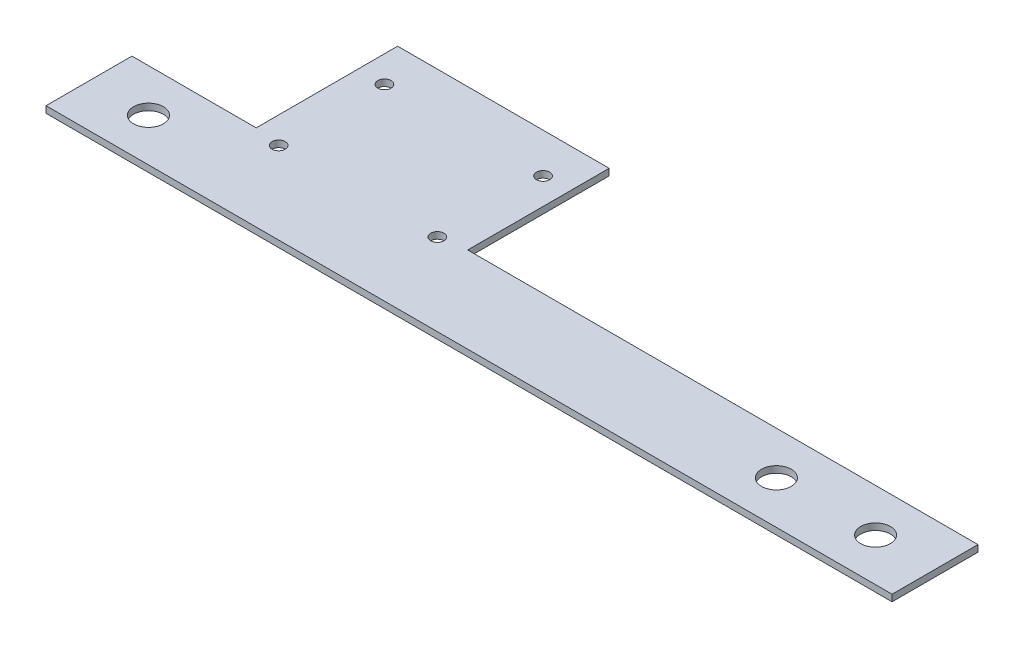
ISO-10303-21;
HEADER;
FILE_DESCRIPTION(('STEP AP214'),'2;1');
FILE_NAME('part.step','',(''),(''),'','','');
FILE_SCHEMA(('AUTOMOTIVE_DESIGN { 1 0 10303 214 1 1 1 1 }'));
ENDSEC;
DATA;
#1=APPLICATION_CONTEXT('core data for automotive mechanical design processes');
#2=APPLICATION_PROTOCOL_DEFINITION('international standard','automotive_design',2000,#1);
#3=PRODUCT_CONTEXT('',#1,'mechanical');
#4=PRODUCT('Part','Part','',(#3));
#5=PRODUCT_RELATED_PRODUCT_CATEGORY('part','',(#4));
#6=PRODUCT_DEFINITION_FORMATION('','',#4);
#7=PRODUCT_DEFINITION_CONTEXT('part definition',#1,'design');
#8=PRODUCT_DEFINITION('design','',#6,#7);
#9=PRODUCT_DEFINITION_SHAPE('','',#8);
#10=(LENGTH_UNIT() NAMED_UNIT(*) SI_UNIT(.MILLI.,.METRE.));
#11=(NAMED_UNIT(*) PLANE_ANGLE_UNIT() SI_UNIT($,.RADIAN.));
#12=(NAMED_UNIT(*) SI_UNIT($,.STERADIAN.) SOLID_ANGLE_UNIT());
#13=UNCERTAINTY_MEASURE_WITH_UNIT(LENGTH_MEASURE(1.E-05),#10,'distance_accuracy_value','');
#14=(GEOMETRIC_REPRESENTATION_CONTEXT(3) GLOBAL_UNCERTAINTY_ASSIGNED_CONTEXT((#13)) GLOBAL_UNIT_ASSIGNED_CONTEXT((#10,
#11,#12)) REPRESENTATION_CONTEXT('',''));
#15=CARTESIAN_POINT('',(0.,0.,0.));
#16=DIRECTION('',(0.,0.,1.));
#17=DIRECTION('',(1.,0.,0.));
#18=AXIS2_PLACEMENT_3D('',#15,#16,#17);
#19=CARTESIAN_POINT('',(0.,3.175,-41.2749999999999));
#20=DIRECTION('',(1.,0.,0.));
#21=DIRECTION('',(0.,0.,-1.));
#22=AXIS2_PLACEMENT_3D('',#19,#20,#21);
#23=PLANE('',#22);
#24=DIRECTION('',(0.,0.,1.));
#25=VECTOR('',#24,1.);
#26=CARTESIAN_POINT('',(0.,0.,-41.2749999999999));
#27=LINE('',#26,#25);
#28=CARTESIAN_POINT('',(0.,0.,-41.2749999999999));
#29=VERTEX_POINT('',#28);
#30=CARTESIAN_POINT('',(0.,0.,0.));
#31=VERTEX_POINT('',#30);
#32=EDGE_CURVE('E128',#29,#31,#27,.T.);
#33=ORIENTED_EDGE('',*,*,#32,.T.);
#34=DIRECTION('',(0.,-1.,0.));
#35=VECTOR('',#34,1.);
#36=CARTESIAN_POINT('',(0.,3.175,0.));
#37=LINE('',#36,#35);
#38=CARTESIAN_POINT('',(0.,3.175,0.));
#39=VERTEX_POINT('',#38);
#40=EDGE_CURVE('E11',#39,#31,#37,.T.);
#41=ORIENTED_EDGE('',*,*,#40,.F.);
#42=DIRECTION('',(0.,0.,1.));
#43=VECTOR('',#42,1.);
#44=CARTESIAN_POINT('',(0.,3.175,-41.2749999999999));
#45=LINE('',#44,#43);
#46=CARTESIAN_POINT('',(0.,3.175,-41.2749999999999));
#47=VERTEX_POINT('',#46);
#48=EDGE_CURVE('E143',#47,#39,#45,.T.);
#49=ORIENTED_EDGE('',*,*,#48,.F.);
#50=DIRECTION('',(0.,-1.,0.));
#51=VECTOR('',#50,1.);
#52=CARTESIAN_POINT('',(0.,3.175,-41.2749999999999));
#53=LINE('',#52,#51);
#54=EDGE_CURVE('E124',#47,#29,#53,.T.);
#55=ORIENTED_EDGE('',*,*,#54,.T.);
#56=EDGE_LOOP('',(#33,#41,#49,#55));
#57=FACE_BOUND('',#56,.T.);
#58=ADVANCED_FACE('F32',(#57),#23,.F.);
#59=CARTESIAN_POINT('',(0.,3.175,0.));
#60=DIRECTION('',(0.,0.,-1.));
#61=DIRECTION('',(-1.,0.,0.));
#62=AXIS2_PLACEMENT_3D('',#59,#60,#61);
#63=PLANE('',#62);
#64=DIRECTION('',(1.,0.,0.));
#65=VECTOR('',#64,1.);
#66=CARTESIAN_POINT('',(0.,0.,0.));
#67=LINE('',#66,#65);
#68=CARTESIAN_POINT('',(406.4,0.,0.));
#69=VERTEX_POINT('',#68);
#70=EDGE_CURVE('E131',#31,#69,#67,.T.);
#71=ORIENTED_EDGE('',*,*,#70,.T.);
#72=DIRECTION('',(0.,-1.,0.));
#73=VECTOR('',#72,1.);
#74=CARTESIAN_POINT('',(406.4,3.175,0.));
#75=LINE('',#74,#73);
#76=CARTESIAN_POINT('',(406.4,3.175,0.));
#77=VERTEX_POINT('',#76);
#78=EDGE_CURVE('E40',#77,#69,#75,.T.);
#79=ORIENTED_EDGE('',*,*,#78,.F.);
#80=DIRECTION('',(1.,0.,0.));
#81=VECTOR('',#80,1.);
#82=CARTESIAN_POINT('',(0.,3.175,0.));
#83=LINE('',#82,#81);
#84=EDGE_CURVE('E91',#39,#77,#83,.T.);
#85=ORIENTED_EDGE('',*,*,#84,.F.);
#86=ORIENTED_EDGE('',*,*,#40,.T.);
#87=EDGE_LOOP('',(#71,#79,#85,#86));
#88=FACE_BOUND('',#87,.T.);
#89=ADVANCED_FACE('F258',(#88),#63,.F.);
#90=CARTESIAN_POINT('',(406.4,3.175,0.));
#91=DIRECTION('',(-1.,0.,0.));
#92=DIRECTION('',(0.,0.,1.));
#93=AXIS2_PLACEMENT_3D('',#90,#91,#92);
#94=PLANE('',#93);
#95=DIRECTION('',(0.,0.,-1.));
#96=VECTOR('',#95,1.);
#97=CARTESIAN_POINT('',(406.4,0.,0.));
#98=LINE('',#97,#96);
#99=CARTESIAN_POINT('',(406.4,0.,-41.275));
#100=VERTEX_POINT('',#99);
#101=EDGE_CURVE('E134',#69,#100,#98,.T.);
#102=ORIENTED_EDGE('',*,*,#101,.T.);
#103=DIRECTION('',(0.,-1.,0.));
#104=VECTOR('',#103,1.);
#105=CARTESIAN_POINT('',(406.4,3.175,-41.275));
#106=LINE('',#105,#104);
#107=CARTESIAN_POINT('',(406.4,3.175,-41.275));
#108=VERTEX_POINT('',#107);
#109=EDGE_CURVE('E150',#108,#100,#106,.T.);
#110=ORIENTED_EDGE('',*,*,#109,.F.);
#111=DIRECTION('',(0.,0.,-1.));
#112=VECTOR('',#111,1.);
#113=CARTESIAN_POINT('',(406.4,3.175,0.));
#114=LINE('',#113,#112);
#115=EDGE_CURVE('E158',#77,#108,#114,.T.);
#116=ORIENTED_EDGE('',*,*,#115,.F.);
#117=ORIENTED_EDGE('',*,*,#78,.T.);
#118=EDGE_LOOP('',(#102,#110,#116,#117));
#119=FACE_BOUND('',#118,.T.);
#120=ADVANCED_FACE('F156',(#119),#94,.F.);
#121=CARTESIAN_POINT('',(406.4,3.175,-41.275));
#122=DIRECTION('',(0.,0.,1.));
#123=DIRECTION('',(1.,0.,0.));
#124=AXIS2_PLACEMENT_3D('',#121,#122,#123);
#125=PLANE('',#124);
#126=DIRECTION('',(-1.,0.,0.));
#127=VECTOR('',#126,1.);
#128=CARTESIAN_POINT('',(406.4,0.,-41.275));
#129=LINE('',#128,#127);
#130=CARTESIAN_POINT('',(161.29,0.,-41.275));
#131=VERTEX_POINT('',#130);
#132=EDGE_CURVE('E136',#100,#131,#129,.T.);
#133=ORIENTED_EDGE('',*,*,#132,.T.);
#134=DIRECTION('',(0.,-1.,0.));
#135=VECTOR('',#134,1.);
#136=CARTESIAN_POINT('',(161.29,3.175,-41.275));
#137=LINE('',#136,#135);
#138=CARTESIAN_POINT('',(161.29,3.175,-41.275));
#139=VERTEX_POINT('',#138);
#140=EDGE_CURVE('E147',#139,#131,#137,.T.);
#141=ORIENTED_EDGE('',*,*,#140,.F.);
#142=DIRECTION('',(-1.,0.,0.));
#143=VECTOR('',#142,1.);
#144=CARTESIAN_POINT('',(406.4,3.175,-41.275));
#145=LINE('',#144,#143);
#146=EDGE_CURVE('E170',#108,#139,#145,.T.);
#147=ORIENTED_EDGE('',*,*,#146,.F.);
#148=ORIENTED_EDGE('',*,*,#109,.T.);
#149=EDGE_LOOP('',(#133,#141,#147,#148));
#150=FACE_BOUND('',#149,.T.);
#151=ADVANCED_FACE('F166',(#150),#125,.F.);
#152=CARTESIAN_POINT('',(161.29,3.175,-41.275));
#153=DIRECTION('',(-1.,0.,0.));
#154=DIRECTION('',(0.,0.,1.));
#155=AXIS2_PLACEMENT_3D('',#152,#153,#154);
#156=PLANE('',#155);
#157=DIRECTION('',(0.,0.,-1.));
#158=VECTOR('',#157,1.);
#159=CARTESIAN_POINT('',(161.29,0.,-41.275));
#160=LINE('',#159,#158);
#161=CARTESIAN_POINT('',(161.29,0.,-109.22));
#162=VERTEX_POINT('',#161);
#163=EDGE_CURVE('E138',#131,#162,#160,.T.);
#164=ORIENTED_EDGE('',*,*,#163,.T.);
#165=DIRECTION('',(0.,-1.,0.));
#166=VECTOR('',#165,1.);
#167=CARTESIAN_POINT('',(161.29,3.175,-109.22));
#168=LINE('',#167,#166);
#169=CARTESIAN_POINT('',(161.29,3.175,-109.22));
#170=VERTEX_POINT('',#169);
#171=EDGE_CURVE('E119',#170,#162,#168,.T.);
#172=ORIENTED_EDGE('',*,*,#171,.F.);
#173=DIRECTION('',(0.,0.,-1.));
#174=VECTOR('',#173,1.);
#175=CARTESIAN_POINT('',(161.29,3.175,-41.275));
#176=LINE('',#175,#174);
#177=EDGE_CURVE('E110',#139,#170,#176,.T.);
#178=ORIENTED_EDGE('',*,*,#177,.F.);
#179=ORIENTED_EDGE('',*,*,#140,.T.);
#180=EDGE_LOOP('',(#164,#172,#178,#179));
#181=FACE_BOUND('',#180,.T.);
#182=ADVANCED_FACE('F169',(#181),#156,.F.);
#183=CARTESIAN_POINT('',(161.29,3.175,-109.22));
#184=DIRECTION('',(0.,0.,1.));
#185=DIRECTION('',(1.,0.,0.));
#186=AXIS2_PLACEMENT_3D('',#183,#184,#185);
#187=PLANE('',#186);
#188=DIRECTION('',(-1.,0.,0.));
#189=VECTOR('',#188,1.);
#190=CARTESIAN_POINT('',(161.29,0.,-109.22));
#191=LINE('',#190,#189);
#192=CARTESIAN_POINT('',(59.69,0.,-109.22));
#193=VERTEX_POINT('',#192);
#194=EDGE_CURVE('E118',#162,#193,#191,.T.);
#195=ORIENTED_EDGE('',*,*,#194,.T.);
#196=DIRECTION('',(0.,-1.,0.));
#197=VECTOR('',#196,1.);
#198=CARTESIAN_POINT('',(59.69,3.175,-109.22));
#199=LINE('',#198,#197);
#200=CARTESIAN_POINT('',(59.69,3.175,-109.22));
#201=VERTEX_POINT('',#200);
#202=EDGE_CURVE('E115',#201,#193,#199,.T.);
#203=ORIENTED_EDGE('',*,*,#202,.F.);
#204=DIRECTION('',(-1.,0.,0.));
#205=VECTOR('',#204,1.);
#206=CARTESIAN_POINT('',(161.29,3.175,-109.22));
#207=LINE('',#206,#205);
#208=EDGE_CURVE('E104',#170,#201,#207,.T.);
#209=ORIENTED_EDGE('',*,*,#208,.F.);
#210=ORIENTED_EDGE('',*,*,#171,.T.);
#211=EDGE_LOOP('',(#195,#203,#209,#210));
#212=FACE_BOUND('',#211,.T.);
#213=ADVANCED_FACE('F116',(#212),#187,.F.);
#214=CARTESIAN_POINT('',(59.69,3.175,-109.22));
#215=DIRECTION('',(1.,0.,0.));
#216=DIRECTION('',(0.,0.,-1.));
#217=AXIS2_PLACEMENT_3D('',#214,#215,#216);
#218=PLANE('',#217);
#219=DIRECTION('',(0.,0.,1.));
#220=VECTOR('',#219,1.);
#221=CARTESIAN_POINT('',(59.69,0.,-109.22));
#222=LINE('',#221,#220);
#223=CARTESIAN_POINT('',(59.69,0.,-41.2749999999999));
#224=VERTEX_POINT('',#223);
#225=EDGE_CURVE('E77',#193,#224,#222,.T.);
#226=ORIENTED_EDGE('',*,*,#225,.T.);
#227=DIRECTION('',(0.,-1.,0.));
#228=VECTOR('',#227,1.);
#229=CARTESIAN_POINT('',(59.69,3.175,-41.2749999999999));
#230=LINE('',#229,#228);
#231=CARTESIAN_POINT('',(59.69,3.175,-41.2749999999999));
#232=VERTEX_POINT('',#231);
#233=EDGE_CURVE('E120',#232,#224,#230,.T.);
#234=ORIENTED_EDGE('',*,*,#233,.F.);
#235=DIRECTION('',(0.,0.,1.));
#236=VECTOR('',#235,1.);
#237=CARTESIAN_POINT('',(59.69,3.175,-109.22));
#238=LINE('',#237,#236);
#239=EDGE_CURVE('E108',#201,#232,#238,.T.);
#240=ORIENTED_EDGE('',*,*,#239,.F.);
#241=ORIENTED_EDGE('',*,*,#202,.T.);
#242=EDGE_LOOP('',(#226,#234,#240,#241));
#243=FACE_BOUND('',#242,.T.);
#244=ADVANCED_FACE('F122',(#243),#218,.F.);
#245=CARTESIAN_POINT('',(59.69,3.175,-41.2749999999999));
#246=DIRECTION('',(0.,0.,1.));
#247=DIRECTION('',(1.,0.,0.));
#248=AXIS2_PLACEMENT_3D('',#245,#246,#247);
#249=PLANE('',#248);
#250=DIRECTION('',(-1.,0.,0.));
#251=VECTOR('',#250,1.);
#252=CARTESIAN_POINT('',(59.69,0.,-41.2749999999999));
#253=LINE('',#252,#251);
#254=EDGE_CURVE('E83',#224,#29,#253,.T.);
#255=ORIENTED_EDGE('',*,*,#254,.T.);
#256=ORIENTED_EDGE('',*,*,#54,.F.);
#257=DIRECTION('',(-1.,0.,0.));
#258=VECTOR('',#257,1.);
#259=CARTESIAN_POINT('',(59.69,3.175,-41.2749999999999));
#260=LINE('',#259,#258);
#261=EDGE_CURVE('E48',#232,#47,#260,.T.);
#262=ORIENTED_EDGE('',*,*,#261,.F.);
#263=ORIENTED_EDGE('',*,*,#233,.T.);
#264=EDGE_LOOP('',(#255,#256,#262,#263));
#265=FACE_BOUND('',#264,.T.);
#266=ADVANCED_FACE('F229',(#265),#249,.F.);
#267=CARTESIAN_POINT('',(0.,3.175,0.));
#268=DIRECTION('',(0.,1.,0.));
#269=DIRECTION('',(0.,0.,1.));
#270=AXIS2_PLACEMENT_3D('',#267,#268,#269);
#271=PLANE('',#270);
#272=CARTESIAN_POINT('',(148.59,3.175,-90.17));
#273=DIRECTION('',(0.,1.,0.));
#274=DIRECTION('',(0.,0.,1.));
#275=AXIS2_PLACEMENT_3D('',#272,#273,#274);
#276=CIRCLE('',#275,3.17499999999997);
#277=CARTESIAN_POINT('',(148.59,3.175,-86.995));
#278=VERTEX_POINT('',#277);
#279=EDGE_CURVE('E212',#278,#278,#276,.T.);
#280=ORIENTED_EDGE('',*,*,#279,.F.);
#281=EDGE_LOOP('',(#280));
#282=FACE_BOUND('',#281,.T.);
#283=CARTESIAN_POINT('',(148.59,3.175,-39.37));
#284=DIRECTION('',(0.,1.,0.));
#285=DIRECTION('',(0.,0.,1.));
#286=AXIS2_PLACEMENT_3D('',#283,#284,#285);
#287=CIRCLE('',#286,3.175);
#288=CARTESIAN_POINT('',(148.59,3.175,-36.195));
#289=VERTEX_POINT('',#288);
#290=EDGE_CURVE('E206',#289,#289,#287,.T.);
#291=ORIENTED_EDGE('',*,*,#290,.F.);
#292=EDGE_LOOP('',(#291));
#293=FACE_BOUND('',#292,.T.);
#294=CARTESIAN_POINT('',(72.39,3.175,-39.37));
#295=DIRECTION('',(0.,1.,0.));
#296=DIRECTION('',(0.,0.,1.));
#297=AXIS2_PLACEMENT_3D('',#294,#295,#296);
#298=CIRCLE('',#297,3.175);
#299=CARTESIAN_POINT('',(72.39,3.175,-36.195));
#300=VERTEX_POINT('',#299);
#301=EDGE_CURVE('E200',#300,#300,#298,.T.);
#302=ORIENTED_EDGE('',*,*,#301,.F.);
#303=EDGE_LOOP('',(#302));
#304=FACE_BOUND('',#303,.T.);
#305=CARTESIAN_POINT('',(377.825,3.175,-20.6375));
#306=DIRECTION('',(0.,1.,0.));
#307=DIRECTION('',(0.,0.,1.));
#308=AXIS2_PLACEMENT_3D('',#305,#306,#307);
#309=CIRCLE('',#308,7.14375000000002);
#310=CARTESIAN_POINT('',(377.825,3.175,-13.49375));
#311=VERTEX_POINT('',#310);
#312=EDGE_CURVE('E194',#311,#311,#309,.T.);
#313=ORIENTED_EDGE('',*,*,#312,.F.);
#314=EDGE_LOOP('',(#313));
#315=FACE_BOUND('',#314,.T.);
#316=CARTESIAN_POINT('',(330.2,3.175,-20.6375));
#317=DIRECTION('',(0.,1.,0.));
#318=DIRECTION('',(0.,0.,1.));
#319=AXIS2_PLACEMENT_3D('',#316,#317,#318);
#320=CIRCLE('',#319,7.14375000000002);
#321=CARTESIAN_POINT('',(330.2,3.175,-13.49375));
#322=VERTEX_POINT('',#321);
#323=EDGE_CURVE('E188',#322,#322,#320,.T.);
#324=ORIENTED_EDGE('',*,*,#323,.F.);
#325=EDGE_LOOP('',(#324));
#326=FACE_BOUND('',#325,.T.);
#327=CARTESIAN_POINT('',(72.39,3.175,-90.17));
#328=DIRECTION('',(0.,1.,0.));
#329=DIRECTION('',(0.,0.,1.));
#330=AXIS2_PLACEMENT_3D('',#327,#328,#329);
#331=CIRCLE('',#330,3.175);
#332=CARTESIAN_POINT('',(72.39,3.175,-86.995));
#333=VERTEX_POINT('',#332);
#334=EDGE_CURVE('E182',#333,#333,#331,.T.);
#335=ORIENTED_EDGE('',*,*,#334,.F.);
#336=EDGE_LOOP('',(#335));
#337=FACE_BOUND('',#336,.T.);
#338=CARTESIAN_POINT('',(28.575,3.175,-20.6375));
#339=DIRECTION('',(0.,1.,0.));
#340=DIRECTION('',(0.,0.,1.));
#341=AXIS2_PLACEMENT_3D('',#338,#339,#340);
#342=CIRCLE('',#341,7.14374999999999);
#343=CARTESIAN_POINT('',(28.575,3.175,-13.49375));
#344=VERTEX_POINT('',#343);
#345=EDGE_CURVE('E176',#344,#344,#342,.T.);
#346=ORIENTED_EDGE('',*,*,#345,.F.);
#347=EDGE_LOOP('',(#346));
#348=FACE_BOUND('',#347,.T.);
#349=ORIENTED_EDGE('',*,*,#48,.T.);
#350=ORIENTED_EDGE('',*,*,#84,.T.);
#351=ORIENTED_EDGE('',*,*,#115,.T.);
#352=ORIENTED_EDGE('',*,*,#146,.T.);
#353=ORIENTED_EDGE('',*,*,#177,.T.);
#354=ORIENTED_EDGE('',*,*,#208,.T.);
#355=ORIENTED_EDGE('',*,*,#239,.T.);
#356=ORIENTED_EDGE('',*,*,#261,.T.);
#357=EDGE_LOOP('',(#349,#350,#351,#352,#353,#354,#355,#356));
#358=FACE_BOUND('',#357,.T.);
#359=ADVANCED_FACE('F106',(#282,#293,#304,#315,#326,#337,#348,#358),#271,.T.);
#360=CARTESIAN_POINT('',(0.,0.,0.));
#361=DIRECTION('',(0.,1.,0.));
#362=DIRECTION('',(0.,0.,1.));
#363=AXIS2_PLACEMENT_3D('',#360,#361,#362);
#364=PLANE('',#363);
#365=CARTESIAN_POINT('',(148.59,0.,-90.17));
#366=DIRECTION('',(0.,1.,0.));
#367=DIRECTION('',(0.,0.,1.));
#368=AXIS2_PLACEMENT_3D('',#365,#366,#367);
#369=CIRCLE('',#368,3.17499999999997);
#370=CARTESIAN_POINT('',(148.59,0.,-86.995));
#371=VERTEX_POINT('',#370);
#372=EDGE_CURVE('E209',#371,#371,#369,.T.);
#373=ORIENTED_EDGE('',*,*,#372,.T.);
#374=EDGE_LOOP('',(#373));
#375=FACE_BOUND('',#374,.T.);
#376=CARTESIAN_POINT('',(148.59,0.,-39.37));
#377=DIRECTION('',(0.,1.,0.));
#378=DIRECTION('',(0.,0.,1.));
#379=AXIS2_PLACEMENT_3D('',#376,#377,#378);
#380=CIRCLE('',#379,3.175);
#381=CARTESIAN_POINT('',(148.59,0.,-36.195));
#382=VERTEX_POINT('',#381);
#383=EDGE_CURVE('E203',#382,#382,#380,.T.);
#384=ORIENTED_EDGE('',*,*,#383,.T.);
#385=EDGE_LOOP('',(#384));
#386=FACE_BOUND('',#385,.T.);
#387=CARTESIAN_POINT('',(72.39,0.,-39.37));
#388=DIRECTION('',(0.,1.,0.));
#389=DIRECTION('',(0.,0.,1.));
#390=AXIS2_PLACEMENT_3D('',#387,#388,#389);
#391=CIRCLE('',#390,3.175);
#392=CARTESIAN_POINT('',(72.39,0.,-36.195));
#393=VERTEX_POINT('',#392);
#394=EDGE_CURVE('E197',#393,#393,#391,.T.);
#395=ORIENTED_EDGE('',*,*,#394,.T.);
#396=EDGE_LOOP('',(#395));
#397=FACE_BOUND('',#396,.T.);
#398=CARTESIAN_POINT('',(377.825,0.,-20.6375));
#399=DIRECTION('',(0.,1.,0.));
#400=DIRECTION('',(0.,0.,1.));
#401=AXIS2_PLACEMENT_3D('',#398,#399,#400);
#402=CIRCLE('',#401,7.14375000000002);
#403=CARTESIAN_POINT('',(377.825,0.,-13.49375));
#404=VERTEX_POINT('',#403);
#405=EDGE_CURVE('E191',#404,#404,#402,.T.);
#406=ORIENTED_EDGE('',*,*,#405,.T.);
#407=EDGE_LOOP('',(#406));
#408=FACE_BOUND('',#407,.T.);
#409=CARTESIAN_POINT('',(330.2,0.,-20.6375));
#410=DIRECTION('',(0.,1.,0.));
#411=DIRECTION('',(0.,0.,1.));
#412=AXIS2_PLACEMENT_3D('',#409,#410,#411);
#413=CIRCLE('',#412,7.14375000000002);
#414=CARTESIAN_POINT('',(330.2,0.,-13.49375));
#415=VERTEX_POINT('',#414);
#416=EDGE_CURVE('E185',#415,#415,#413,.T.);
#417=ORIENTED_EDGE('',*,*,#416,.T.);
#418=EDGE_LOOP('',(#417));
#419=FACE_BOUND('',#418,.T.);
#420=CARTESIAN_POINT('',(72.39,0.,-90.17));
#421=DIRECTION('',(0.,1.,0.));
#422=DIRECTION('',(0.,0.,1.));
#423=AXIS2_PLACEMENT_3D('',#420,#421,#422);
#424=CIRCLE('',#423,3.175);
#425=CARTESIAN_POINT('',(72.39,0.,-86.995));
#426=VERTEX_POINT('',#425);
#427=EDGE_CURVE('E179',#426,#426,#424,.T.);
#428=ORIENTED_EDGE('',*,*,#427,.T.);
#429=EDGE_LOOP('',(#428));
#430=FACE_BOUND('',#429,.T.);
#431=CARTESIAN_POINT('',(28.575,0.,-20.6375));
#432=DIRECTION('',(0.,1.,0.));
#433=DIRECTION('',(0.,0.,1.));
#434=AXIS2_PLACEMENT_3D('',#431,#432,#433);
#435=CIRCLE('',#434,7.14374999999999);
#436=CARTESIAN_POINT('',(28.575,0.,-13.49375));
#437=VERTEX_POINT('',#436);
#438=EDGE_CURVE('E132',#437,#437,#435,.T.);
#439=ORIENTED_EDGE('',*,*,#438,.T.);
#440=EDGE_LOOP('',(#439));
#441=FACE_BOUND('',#440,.T.);
#442=ORIENTED_EDGE('',*,*,#32,.F.);
#443=ORIENTED_EDGE('',*,*,#254,.F.);
#444=ORIENTED_EDGE('',*,*,#225,.F.);
#445=ORIENTED_EDGE('',*,*,#194,.F.);
#446=ORIENTED_EDGE('',*,*,#163,.F.);
#447=ORIENTED_EDGE('',*,*,#132,.F.);
#448=ORIENTED_EDGE('',*,*,#101,.F.);
#449=ORIENTED_EDGE('',*,*,#70,.F.);
#450=EDGE_LOOP('',(#442,#443,#444,#445,#446,#447,#448,#449));
#451=FACE_BOUND('',#450,.T.);
#452=ADVANCED_FACE('F162',(#375,#386,#397,#408,#419,#430,#441,#451),#364,.F.);
#453=CARTESIAN_POINT('',(28.575,0.,-20.6375));
#454=DIRECTION('',(0.,1.,0.));
#455=DIRECTION('',(0.,0.,1.));
#456=AXIS2_PLACEMENT_3D('',#453,#454,#455);
#457=CYLINDRICAL_SURFACE('',#456,7.14374999999999);
#458=ORIENTED_EDGE('',*,*,#438,.F.);
#459=EDGE_LOOP('',(#458));
#460=FACE_BOUND('',#459,.T.);
#461=ORIENTED_EDGE('',*,*,#345,.T.);
#462=EDGE_LOOP('',(#461));
#463=FACE_BOUND('',#462,.T.);
#464=ADVANCED_FACE('F243',(#460,#463),#457,.F.);
#465=CARTESIAN_POINT('',(72.39,0.,-90.17));
#466=DIRECTION('',(0.,1.,0.));
#467=DIRECTION('',(0.,0.,1.));
#468=AXIS2_PLACEMENT_3D('',#465,#466,#467);
#469=CYLINDRICAL_SURFACE('',#468,3.175);
#470=ORIENTED_EDGE('',*,*,#427,.F.);
#471=EDGE_LOOP('',(#470));
#472=FACE_BOUND('',#471,.T.);
#473=ORIENTED_EDGE('',*,*,#334,.T.);
#474=EDGE_LOOP('',(#473));
#475=FACE_BOUND('',#474,.T.);
#476=ADVANCED_FACE('F245',(#472,#475),#469,.F.);
#477=CARTESIAN_POINT('',(330.2,0.,-20.6375));
#478=DIRECTION('',(0.,1.,0.));
#479=DIRECTION('',(0.,0.,1.));
#480=AXIS2_PLACEMENT_3D('',#477,#478,#479);
#481=CYLINDRICAL_SURFACE('',#480,7.14375000000002);
#482=ORIENTED_EDGE('',*,*,#416,.F.);
#483=EDGE_LOOP('',(#482));
#484=FACE_BOUND('',#483,.T.);
#485=ORIENTED_EDGE('',*,*,#323,.T.);
#486=EDGE_LOOP('',(#485));
#487=FACE_BOUND('',#486,.T.);
#488=ADVANCED_FACE('F252',(#484,#487),#481,.F.);
#489=CARTESIAN_POINT('',(377.825,0.,-20.6375));
#490=DIRECTION('',(0.,1.,0.));
#491=DIRECTION('',(0.,0.,1.));
#492=AXIS2_PLACEMENT_3D('',#489,#490,#491);
#493=CYLINDRICAL_SURFACE('',#492,7.14375000000002);
#494=ORIENTED_EDGE('',*,*,#405,.F.);
#495=EDGE_LOOP('',(#494));
#496=FACE_BOUND('',#495,.T.);
#497=ORIENTED_EDGE('',*,*,#312,.T.);
#498=EDGE_LOOP('',(#497));
#499=FACE_BOUND('',#498,.T.);
#500=ADVANCED_FACE('F334',(#496,#499),#493,.F.);
#501=CARTESIAN_POINT('',(72.39,0.,-39.37));
#502=DIRECTION('',(0.,1.,0.));
#503=DIRECTION('',(0.,0.,1.));
#504=AXIS2_PLACEMENT_3D('',#501,#502,#503);
#505=CYLINDRICAL_SURFACE('',#504,3.175);
#506=ORIENTED_EDGE('',*,*,#394,.F.);
#507=EDGE_LOOP('',(#506));
#508=FACE_BOUND('',#507,.T.);
#509=ORIENTED_EDGE('',*,*,#301,.T.);
#510=EDGE_LOOP('',(#509));
#511=FACE_BOUND('',#510,.T.);
#512=ADVANCED_FACE('F344',(#508,#511),#505,.F.);
#513=CARTESIAN_POINT('',(148.59,0.,-39.37));
#514=DIRECTION('',(0.,1.,0.));
#515=DIRECTION('',(0.,0.,1.));
#516=AXIS2_PLACEMENT_3D('',#513,#514,#515);
#517=CYLINDRICAL_SURFACE('',#516,3.175);
#518=ORIENTED_EDGE('',*,*,#383,.F.);
#519=EDGE_LOOP('',(#518));
#520=FACE_BOUND('',#519,.T.);
#521=ORIENTED_EDGE('',*,*,#290,.T.);
#522=EDGE_LOOP('',(#521));
#523=FACE_BOUND('',#522,.T.);
#524=ADVANCED_FACE('F223',(#520,#523),#517,.F.);
#525=CARTESIAN_POINT('',(148.59,0.,-90.17));
#526=DIRECTION('',(0.,1.,0.));
#527=DIRECTION('',(0.,0.,1.));
#528=AXIS2_PLACEMENT_3D('',#525,#526,#527);
#529=CYLINDRICAL_SURFACE('',#528,3.17499999999997);
#530=ORIENTED_EDGE('',*,*,#372,.F.);
#531=EDGE_LOOP('',(#530));
#532=FACE_BOUND('',#531,.T.);
#533=ORIENTED_EDGE('',*,*,#279,.T.);
#534=EDGE_LOOP('',(#533));
#535=FACE_BOUND('',#534,.T.);
#536=ADVANCED_FACE('F220',(#532,#535),#529,.F.);
#537=CLOSED_SHELL('',(#58,#89,#120,#151,#182,#213,#244,#266,#359,#452,#464,#476,#488,#500,#512,
#524,#536));
#538=MANIFOLD_SOLID_BREP('B2',#537);
#539=ADVANCED_BREP_SHAPE_REPRESENTATION('',(#18,#538),#14);
#540=SHAPE_DEFINITION_REPRESENTATION(#9,#539);
ENDSEC;
END-ISO-10303-21;
